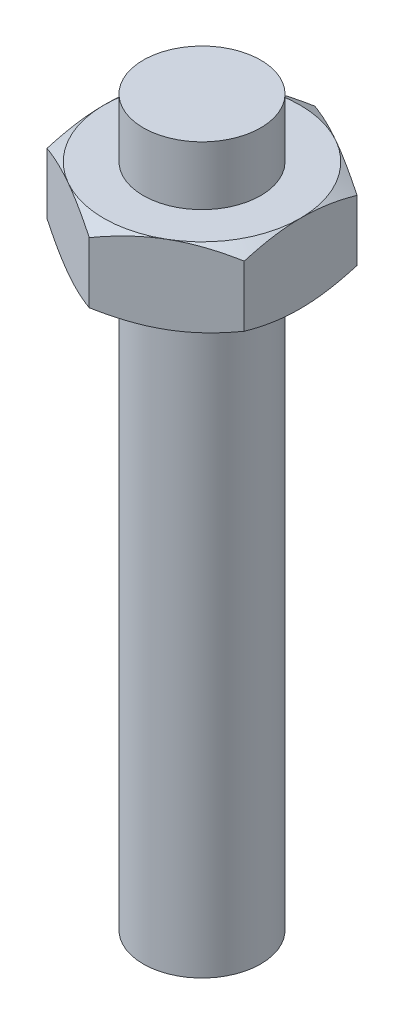
ISO-10303-21;
HEADER;
FILE_DESCRIPTION(('STEP AP214'),'2;1');
FILE_NAME('part.step','',(''),(''),'','','');
FILE_SCHEMA(('AUTOMOTIVE_DESIGN { 1 0 10303 214 1 1 1 1 }'));
ENDSEC;
DATA;
#1=APPLICATION_CONTEXT('core data for automotive mechanical design processes');
#2=APPLICATION_PROTOCOL_DEFINITION('international standard','automotive_design',2000,#1);
#3=PRODUCT_CONTEXT('',#1,'mechanical');
#4=PRODUCT('Part','Part','',(#3));
#5=PRODUCT_RELATED_PRODUCT_CATEGORY('part','',(#4));
#6=PRODUCT_DEFINITION_FORMATION('','',#4);
#7=PRODUCT_DEFINITION_CONTEXT('part definition',#1,'design');
#8=PRODUCT_DEFINITION('design','',#6,#7);
#9=PRODUCT_DEFINITION_SHAPE('','',#8);
#10=(LENGTH_UNIT() NAMED_UNIT(*) SI_UNIT(.MILLI.,.METRE.));
#11=(NAMED_UNIT(*) PLANE_ANGLE_UNIT() SI_UNIT($,.RADIAN.));
#12=(NAMED_UNIT(*) SI_UNIT($,.STERADIAN.) SOLID_ANGLE_UNIT());
#13=UNCERTAINTY_MEASURE_WITH_UNIT(LENGTH_MEASURE(1.E-05),#10,'distance_accuracy_value','');
#14=(GEOMETRIC_REPRESENTATION_CONTEXT(3) GLOBAL_UNCERTAINTY_ASSIGNED_CONTEXT((#13)) GLOBAL_UNIT_ASSIGNED_CONTEXT((#10,
#11,#12)) REPRESENTATION_CONTEXT('',''));
#15=CARTESIAN_POINT('',(0.,0.,0.));
#16=DIRECTION('',(0.,0.,1.));
#17=DIRECTION('',(1.,0.,0.));
#18=AXIS2_PLACEMENT_3D('',#15,#16,#17);
#19=CARTESIAN_POINT('',(0.,0.,0.));
#20=DIRECTION('',(0.,1.,0.));
#21=DIRECTION('',(0.,0.,1.));
#22=AXIS2_PLACEMENT_3D('',#19,#20,#21);
#23=PLANE('',#22);
#24=CARTESIAN_POINT('',(0.,0.,0.));
#25=DIRECTION('',(0.,1.,0.));
#26=DIRECTION('',(0.,0.,1.));
#27=AXIS2_PLACEMENT_3D('',#24,#25,#26);
#28=CIRCLE('',#27,5.01430599676595);
#29=CARTESIAN_POINT('',(2.5284905831747,0.,4.33012701892218));
#30=VERTEX_POINT('',#29);
#31=CARTESIAN_POINT('',(5.01424529158734,0.,-0.0246735687979292));
#32=VERTEX_POINT('',#31);
#33=EDGE_CURVE('E44',#30,#32,#28,.T.);
#34=ORIENTED_EDGE('',*,*,#33,.F.);
#35=CARTESIAN_POINT('',(-2.48575470841264,0.,4.35480058772011));
#36=VERTEX_POINT('',#35);
#37=EDGE_CURVE('E132',#36,#30,#28,.T.);
#38=ORIENTED_EDGE('',*,*,#37,.F.);
#39=CARTESIAN_POINT('',(-5.01424529158734,0.,0.02467356879793));
#40=VERTEX_POINT('',#39);
#41=EDGE_CURVE('E176',#40,#36,#28,.T.);
#42=ORIENTED_EDGE('',*,*,#41,.F.);
#43=CARTESIAN_POINT('',(-2.5284905831747,0.,-4.33012701892218));
#44=VERTEX_POINT('',#43);
#45=EDGE_CURVE('E177',#44,#40,#28,.T.);
#46=ORIENTED_EDGE('',*,*,#45,.F.);
#47=CARTESIAN_POINT('',(2.48575470841264,0.,-4.35480058772011));
#48=VERTEX_POINT('',#47);
#49=EDGE_CURVE('E180',#48,#44,#28,.T.);
#50=ORIENTED_EDGE('',*,*,#49,.F.);
#51=CARTESIAN_POINT('',(0.,0.,0.));
#52=DIRECTION('',(0.,-1.,0.));
#53=DIRECTION('',(0.,0.,-1.));
#54=AXIS2_PLACEMENT_3D('',#51,#52,#53);
#55=CIRCLE('',#54,5.01430599676595);
#56=EDGE_CURVE('E138',#48,#32,#55,.T.);
#57=ORIENTED_EDGE('',*,*,#56,.T.);
#58=EDGE_LOOP('',(#34,#38,#42,#46,#50,#57));
#59=FACE_BOUND('',#58,.T.);
#60=CARTESIAN_POINT('',(0.,0.,0.));
#61=DIRECTION('',(0.,1.,0.));
#62=DIRECTION('',(0.,0.,1.));
#63=AXIS2_PLACEMENT_3D('',#60,#61,#62);
#64=CIRCLE('',#63,3.);
#65=CARTESIAN_POINT('',(0.,0.,3.));
#66=VERTEX_POINT('',#65);
#67=EDGE_CURVE('E12',#66,#66,#64,.F.);
#68=ORIENTED_EDGE('',*,*,#67,.F.);
#69=EDGE_LOOP('',(#68));
#70=FACE_BOUND('',#69,.T.);
#71=ADVANCED_FACE('F35',(#59,#70),#23,.F.);
#72=CARTESIAN_POINT('',(0.,4.,0.));
#73=DIRECTION('',(0.,1.,0.));
#74=DIRECTION('',(0.,0.,1.));
#75=AXIS2_PLACEMENT_3D('',#72,#73,#74);
#76=PLANE('',#75);
#77=CARTESIAN_POINT('',(0.,4.,0.));
#78=DIRECTION('',(0.,1.,0.));
#79=DIRECTION('',(0.,0.,1.));
#80=AXIS2_PLACEMENT_3D('',#77,#78,#79);
#81=CIRCLE('',#80,5.01430599676595);
#82=CARTESIAN_POINT('',(-2.48575470841264,4.,4.35480058772011));
#83=VERTEX_POINT('',#82);
#84=CARTESIAN_POINT('',(2.5284905831747,4.,4.33012701892218));
#85=VERTEX_POINT('',#84);
#86=EDGE_CURVE('E173',#83,#85,#81,.T.);
#87=ORIENTED_EDGE('',*,*,#86,.T.);
#88=CARTESIAN_POINT('',(0.,4.,0.));
#89=DIRECTION('',(0.,1.,0.));
#90=DIRECTION('',(0.,0.,1.));
#91=AXIS2_PLACEMENT_3D('',#88,#89,#90);
#92=CIRCLE('',#91,5.01430599676595);
#93=CARTESIAN_POINT('',(5.01424529158734,4.,-0.0246735687979292));
#94=VERTEX_POINT('',#93);
#95=EDGE_CURVE('E297',#85,#94,#92,.T.);
#96=ORIENTED_EDGE('',*,*,#95,.T.);
#97=CARTESIAN_POINT('',(2.48575470841264,4.,-4.35480058772011));
#98=VERTEX_POINT('',#97);
#99=EDGE_CURVE('E175',#94,#98,#81,.T.);
#100=ORIENTED_EDGE('',*,*,#99,.T.);
#101=CARTESIAN_POINT('',(-2.5284905831747,4.,-4.33012701892218));
#102=VERTEX_POINT('',#101);
#103=EDGE_CURVE('E179',#98,#102,#81,.T.);
#104=ORIENTED_EDGE('',*,*,#103,.T.);
#105=CARTESIAN_POINT('',(-5.01424529158734,4.,0.02467356879793));
#106=VERTEX_POINT('',#105);
#107=EDGE_CURVE('E293',#102,#106,#81,.T.);
#108=ORIENTED_EDGE('',*,*,#107,.T.);
#109=EDGE_CURVE('E174',#106,#83,#81,.T.);
#110=ORIENTED_EDGE('',*,*,#109,.T.);
#111=EDGE_LOOP('',(#87,#96,#100,#104,#108,#110));
#112=FACE_BOUND('',#111,.T.);
#113=CARTESIAN_POINT('',(0.,4.,0.));
#114=DIRECTION('',(0.,1.,0.));
#115=DIRECTION('',(0.,0.,1.));
#116=AXIS2_PLACEMENT_3D('',#113,#114,#115);
#117=CIRCLE('',#116,3.);
#118=CARTESIAN_POINT('',(0.,4.,3.));
#119=VERTEX_POINT('',#118);
#120=EDGE_CURVE('E369',#119,#119,#117,.T.);
#121=ORIENTED_EDGE('',*,*,#120,.F.);
#122=EDGE_LOOP('',(#121));
#123=FACE_BOUND('',#122,.T.);
#124=ADVANCED_FACE('F294',(#112,#123),#76,.T.);
#125=CARTESIAN_POINT('',(5.02849058317469,4.,2.87030230008283));
#126=DIRECTION('',(-0.999987893603092,0.,0.00492063484235761));
#127=DIRECTION('',(0.00492063484235761,0.,0.999987893603092));
#128=AXIS2_PLACEMENT_3D('',#125,#126,#127);
#129=PLANE('',#128);
#130=CARTESIAN_POINT('',(4.9999990158611,0.447917484700277,-2.91984943767869));
#131=CARTESIAN_POINT('',(5.00125108658539,0.374446528137613,-2.66539943146302));
#132=CARTESIAN_POINT('',(5.00251386630712,0.307621421446591,-2.40877310691777));
#133=CARTESIAN_POINT('',(5.00506129162112,0.190977949349087,-1.89107680238245));
#134=CARTESIAN_POINT('',(5.00634598247228,0.14120084471822,-1.62999762472705));
#135=CARTESIAN_POINT('',(5.00889963872586,0.0637294768664885,-1.11103504778139));
#136=CARTESIAN_POINT('',(5.01016820644773,0.0355191827968383,-0.853232466462973));
#137=CARTESIAN_POINT('',(5.01207552012836,0.0102227694877358,-0.465621792020172));
#138=CARTESIAN_POINT('',(5.01271172642389,0.00462573641110162,-0.336329817762157));
#139=CARTESIAN_POINT('',(5.01398472688311,-0.000800215533808021,-0.0776264007129085));
#140=CARTESIAN_POINT('',(5.01462152102803,-0.000629312581884306,0.0517850382643947));
#141=CARTESIAN_POINT('',(5.01636613881153,0.00777692395854868,0.406332107566666));
#142=CARTESIAN_POINT('',(5.01747338430081,0.0218934907406079,0.631350244454539));
#143=CARTESIAN_POINT('',(5.01968052664195,0.0666562759325538,1.07989310351669));
#144=CARTESIAN_POINT('',(5.02078041573633,0.0973177942957524,1.30341624919304));
#145=CARTESIAN_POINT('',(5.02299200456623,0.173963342665548,1.75286273859509));
#146=CARTESIAN_POINT('',(5.0241034251966,0.220272131434008,1.97872936163798));
#147=CARTESIAN_POINT('',(5.02630969163108,0.325374511175889,2.42709421601792));
#148=CARTESIAN_POINT('',(5.02740456569219,0.384143412596234,2.6495981898347));
#149=CARTESIAN_POINT('',(5.02849156731357,0.447917484700276,2.87050230008283));
#150=B_SPLINE_CURVE_WITH_KNOTS('',3,(#130,#131,#132,#133,#134,#135,#136,#137,#138,#139,#140,
#141,#142,#143,#144,#145,#146,#147,#148,#149),.UNSPECIFIED.,.F.,.F.,(4,2,2,2,2,2,2,2,2,4),(0.,
0.794821338024906,1.59155298495652,2.36856665618577,2.75669843208432,3.14481821804768,
3.82050145746416,4.49681060885583,5.18811978674575,5.87807173689202),.UNSPECIFIED.);
#151=CARTESIAN_POINT('',(4.99999999999998,0.447859747478655,-2.91964943767869));
#152=VERTEX_POINT('',#151);
#153=EDGE_CURVE('E51',#152,#32,#150,.T.);
#154=ORIENTED_EDGE('',*,*,#153,.F.);
#155=DIRECTION('',(0.,-1.,0.));
#156=VECTOR('',#155,1.);
#157=CARTESIAN_POINT('',(4.99999999999998,4.,-2.91964943767869));
#158=LINE('',#157,#156);
#159=CARTESIAN_POINT('',(4.99999999999998,3.55214025252135,-2.91964943767869));
#160=VERTEX_POINT('',#159);
#161=EDGE_CURVE('E170',#160,#152,#158,.T.);
#162=ORIENTED_EDGE('',*,*,#161,.F.);
#163=CARTESIAN_POINT('',(5.02849156731357,3.55208251529972,2.87050230008283));
#164=CARTESIAN_POINT('',(5.02723949658928,3.62555347186239,2.61605229386716));
#165=CARTESIAN_POINT('',(5.02597671686755,3.69237857855341,2.35942596932191));
#166=CARTESIAN_POINT('',(5.02342929155355,3.80902205065091,1.84172966478659));
#167=CARTESIAN_POINT('',(5.02214460070239,3.85879915528178,1.58065048713119));
#168=CARTESIAN_POINT('',(5.01959094444881,3.93627052313351,1.06168791018553));
#169=CARTESIAN_POINT('',(5.01832237672694,3.96448081720316,0.803885328867112));
#170=CARTESIAN_POINT('',(5.01641506304631,3.98977723051226,0.416274654424311));
#171=CARTESIAN_POINT('',(5.01577885675078,3.9953742635889,0.286982680166297));
#172=CARTESIAN_POINT('',(5.01450585629156,4.00080021553381,0.028279263117048));
#173=CARTESIAN_POINT('',(5.01386906214664,4.00062931258188,-0.101132175860255));
#174=CARTESIAN_POINT('',(5.01212444436314,3.99222307604145,-0.455679245162526));
#175=CARTESIAN_POINT('',(5.01101719887386,3.97810650925939,-0.680697382050399));
#176=CARTESIAN_POINT('',(5.00881005653272,3.93334372406745,-1.12924024111255));
#177=CARTESIAN_POINT('',(5.00771016743834,3.90268220570425,-1.3527633867889));
#178=CARTESIAN_POINT('',(5.00549857860844,3.82603665733445,-1.80220987619095));
#179=CARTESIAN_POINT('',(5.00438715797807,3.77972786856599,-2.02807649923384));
#180=CARTESIAN_POINT('',(5.00218089154359,3.67462548882411,-2.47644135361378));
#181=CARTESIAN_POINT('',(5.00108601748248,3.61585658740377,-2.69894532743056));
#182=CARTESIAN_POINT('',(4.9999990158611,3.55208251529972,-2.91984943767869));
#183=B_SPLINE_CURVE_WITH_KNOTS('',3,(#163,#164,#165,#166,#167,#168,#169,#170,#171,#172,#173,
#174,#175,#176,#177,#178,#179,#180,#181,#182),.UNSPECIFIED.,.F.,.F.,(4,2,2,2,2,2,2,2,2,4),(0.,
0.794821338024905,1.59155298495652,2.36856665618577,2.75669843208432,3.14481821804768,
3.82050145746416,4.49681060885583,5.18811978674575,5.87807173689202),.UNSPECIFIED.);
#184=EDGE_CURVE('E272',#94,#160,#183,.T.);
#185=ORIENTED_EDGE('',*,*,#184,.F.);
#186=CARTESIAN_POINT('',(5.02849058317469,3.55214025252135,2.87030230008283));
#187=VERTEX_POINT('',#186);
#188=EDGE_CURVE('E161',#187,#94,#183,.T.);
#189=ORIENTED_EDGE('',*,*,#188,.F.);
#190=DIRECTION('',(0.,-1.,0.));
#191=VECTOR('',#190,1.);
#192=CARTESIAN_POINT('',(5.02849058317469,4.,2.87030230008283));
#193=LINE('',#192,#191);
#194=CARTESIAN_POINT('',(5.02849058317469,0.447859747478654,2.87030230008283));
#195=VERTEX_POINT('',#194);
#196=EDGE_CURVE('E156',#187,#195,#193,.T.);
#197=ORIENTED_EDGE('',*,*,#196,.T.);
#198=EDGE_CURVE('E148',#32,#195,#150,.T.);
#199=ORIENTED_EDGE('',*,*,#198,.F.);
#200=EDGE_LOOP('',(#154,#162,#185,#189,#197,#199));
#201=FACE_BOUND('',#200,.T.);
#202=ADVANCED_FACE('F37',(#201),#129,.F.);
#203=CARTESIAN_POINT('',(4.99999999999998,4.,-2.91964943767869));
#204=DIRECTION('',(-0.495732552025317,0.,0.868475236758347));
#205=DIRECTION('',(0.868475236758347,0.,0.495732552025317));
#206=AXIS2_PLACEMENT_3D('',#203,#204,#205);
#207=PLANE('',#206);
#208=CARTESIAN_POINT('',(-0.0286905831747077,0.447926228072088,-5.79006589934749));
#209=CARTESIAN_POINT('',(0.192296065465768,0.374454553334258,-5.66392496791119));
#210=CARTESIAN_POINT('',(0.415172818406593,0.307628683938442,-5.53670514995199));
#211=CARTESIAN_POINT('',(0.864785619640762,0.190983628851342,-5.28006259764271));
#212=CARTESIAN_POINT('',(1.09152965626008,0.141205704931097,-5.15063530349282));
#213=CARTESIAN_POINT('',(1.54224222213373,0.0637327171769791,-4.89336499680635));
#214=CARTESIAN_POINT('',(1.76614056016625,0.0355216175545699,-4.76556204997579));
#215=CARTESIAN_POINT('',(2.1027756546474,0.0102240367495575,-4.57340806857809));
#216=CARTESIAN_POINT('',(2.21506414638369,0.00462662144995524,-4.50931290706343));
#217=CARTESIAN_POINT('',(2.43974490113167,-0.000800072082288288,-4.38106335056723));
#218=CARTESIAN_POINT('',(2.5521371608308,-0.000629528483201749,-4.31690895747652));
#219=CARTESIAN_POINT('',(2.86006040720272,0.00777586246854357,-4.1411439266604));
#220=CARTESIAN_POINT('',(3.05548936155995,0.0218922835307172,-4.02959152978981));
#221=CARTESIAN_POINT('',(3.44505022864037,0.0666554626951286,-3.80722709769868));
#222=CARTESIAN_POINT('',(3.63918077207081,0.0973175223166123,-3.69641584408132));
#223=CARTESIAN_POINT('',(4.02952650777377,0.173964760147534,-3.47360340275655));
#224=CARTESIAN_POINT('',(4.22569243550712,0.220274718850526,-3.36163033563878));
#225=CARTESIAN_POINT('',(4.61509875558895,0.325379883010159,-3.13935412019999));
#226=CARTESIAN_POINT('',(4.80834413567574,0.384150396705421,-3.02904812483839));
#227=CARTESIAN_POINT('',(5.00019999999998,0.447926228072089,-2.91953527609272));
#228=B_SPLINE_CURVE_WITH_KNOTS('',3,(#208,#209,#210,#211,#212,#213,#214,#215,#216,#217,#218,
#219,#220,#221,#222,#223,#224,#225,#226,#227),.UNSPECIFIED.,.F.,.F.,(4,2,2,2,2,2,2,2,2,4),(0.,
0.794823411774109,1.59155718924444,2.36857273607155,2.75670543860724,3.1448261520024,
3.82052279419409,4.49684539888776,5.18816874193885,5.87813475679396),.UNSPECIFIED.);
#229=CARTESIAN_POINT('',(-0.0284905831747079,0.447859747478655,-5.78995173776152));
#230=VERTEX_POINT('',#229);
#231=EDGE_CURVE('E59',#230,#48,#228,.T.);
#232=ORIENTED_EDGE('',*,*,#231,.F.);
#233=DIRECTION('',(0.,-1.,0.));
#234=VECTOR('',#233,1.);
#235=CARTESIAN_POINT('',(-0.0284905831747077,4.,-5.78995173776152));
#236=LINE('',#235,#234);
#237=CARTESIAN_POINT('',(-0.0284905831747076,3.55214025252135,-5.78995173776152));
#238=VERTEX_POINT('',#237);
#239=EDGE_CURVE('E167',#238,#230,#236,.T.);
#240=ORIENTED_EDGE('',*,*,#239,.F.);
#241=CARTESIAN_POINT('',(5.00019999999998,3.55207377192791,-2.91953527609272));
#242=CARTESIAN_POINT('',(4.7792133513595,3.62554544666574,-3.04567620752903));
#243=CARTESIAN_POINT('',(4.55633659841868,3.69237131606156,-3.17289602548823));
#244=CARTESIAN_POINT('',(4.10672379718451,3.80901637114866,-3.42953857779751));
#245=CARTESIAN_POINT('',(3.8799797605652,3.8587942950689,-3.55896587194739));
#246=CARTESIAN_POINT('',(3.42926719469154,3.93626728282302,-3.81623617863386));
#247=CARTESIAN_POINT('',(3.20536885665902,3.96447838244543,-3.94403912546443));
#248=CARTESIAN_POINT('',(2.86873376217788,3.98977596325044,-4.13619310686212));
#249=CARTESIAN_POINT('',(2.75644527044158,3.99537337855004,-4.20028826837678));
#250=CARTESIAN_POINT('',(2.5317645156936,4.00080007208229,-4.32853782487298));
#251=CARTESIAN_POINT('',(2.41937225599447,4.0006295284832,-4.39269221796369));
#252=CARTESIAN_POINT('',(2.11144900962255,3.99222413753146,-4.56845724877982));
#253=CARTESIAN_POINT('',(1.91602005526533,3.97810771646928,-4.68000964565041));
#254=CARTESIAN_POINT('',(1.5264591881849,3.93334453730487,-4.90237407774153));
#255=CARTESIAN_POINT('',(1.33232864475447,3.90268247768339,-5.0131853313589));
#256=CARTESIAN_POINT('',(0.941982909051504,3.82603523985247,-5.23599777268366));
#257=CARTESIAN_POINT('',(0.745816981318151,3.77972528114947,-5.34797083980144));
#258=CARTESIAN_POINT('',(0.356410661236327,3.67462011698984,-5.57024705524022));
#259=CARTESIAN_POINT('',(0.163165281149531,3.61584960329458,-5.68055305060182));
#260=CARTESIAN_POINT('',(-0.0286905831747084,3.55207377192791,-5.79006589934749));
#261=B_SPLINE_CURVE_WITH_KNOTS('',3,(#241,#242,#243,#244,#245,#246,#247,#248,#249,#250,#251,
#252,#253,#254,#255,#256,#257,#258,#259,#260),.UNSPECIFIED.,.F.,.F.,(4,2,2,2,2,2,2,2,2,4),(0.,
0.794823411774109,1.59155718924444,2.36857273607156,2.75670543860725,3.1448261520024,
3.82052279419409,4.49684539888776,5.18816874193885,5.87813475679396),.UNSPECIFIED.);
#262=EDGE_CURVE('E260',#98,#238,#261,.T.);
#263=ORIENTED_EDGE('',*,*,#262,.F.);
#264=EDGE_CURVE('E265',#160,#98,#261,.T.);
#265=ORIENTED_EDGE('',*,*,#264,.F.);
#266=ORIENTED_EDGE('',*,*,#161,.T.);
#267=EDGE_CURVE('E207',#48,#152,#228,.T.);
#268=ORIENTED_EDGE('',*,*,#267,.F.);
#269=EDGE_LOOP('',(#232,#240,#263,#265,#266,#268));
#270=FACE_BOUND('',#269,.T.);
#271=ADVANCED_FACE('F252',(#270),#207,.F.);
#272=CARTESIAN_POINT('',(-0.0284905831747077,4.,-5.78995173776152));
#273=DIRECTION('',(0.504255341577775,0.,0.863554601915989));
#274=DIRECTION('',(0.863554601915989,0.,-0.504255341577775));
#275=AXIS2_PLACEMENT_3D('',#272,#273,#274);
#276=PLANE('',#275);
#277=CARTESIAN_POINT('',(-5.02869058317469,0.447926606897626,-2.87018551410532));
#278=CARTESIAN_POINT('',(-4.8089559886495,0.374454901043448,-2.99849511117412));
#279=CARTESIAN_POINT('',(-4.58734199871511,0.307628998601953,-3.12790214339286));
#280=CARTESIAN_POINT('',(-4.14027658772118,0.190983874928712,-3.38895699855567));
#281=CARTESIAN_POINT('',(-3.91481722358392,0.141205915511134,-3.52060945970022));
#282=CARTESIAN_POINT('',(-3.46665827795118,0.0637328575715192,-3.78230286242168));
#283=CARTESIAN_POINT('',(-3.2440284900705,0.0355217230469225,-3.91230304942095));
#284=CARTESIAN_POINT('',(-2.90930068132805,0.010224091657783,-4.10776062113501));
#285=CARTESIAN_POINT('',(-2.79764838636964,0.00462665979759133,-4.17295773317319));
#286=CARTESIAN_POINT('',(-2.5742406125009,-0.000800065865445418,-4.30341220944297));
#287=CARTESIAN_POINT('',(-2.46248513688438,-0.000629537836063153,-4.36866957175122));
#288=CARTESIAN_POINT('',(-2.15630635232406,0.00777581647830405,-4.54745651498536));
#289=CARTESIAN_POINT('',(-1.96198449720749,0.0218922312264838,-4.66092685398932));
#290=CARTESIAN_POINT('',(-1.574630481177,0.0666554274600818,-4.88711444100652));
#291=CARTESIAN_POINT('',(-1.38159968180313,0.0973175105325956,-4.99983089397584));
#292=CARTESIAN_POINT('',(-0.993465240699849,0.173964821562911,-5.22647419451803));
#293=CARTESIAN_POINT('',(-0.798410584532968,0.220274830955858,-5.34037243795688));
#294=CARTESIAN_POINT('',(-0.411210237815937,0.325380115756476,-5.56647029286915));
#295=CARTESIAN_POINT('',(-0.21905958776662,0.384150699307086,-5.67867280034237));
#296=CARTESIAN_POINT('',(-0.0282905831747069,0.447926606897628,-5.79006852373903));
#297=B_SPLINE_CURVE_WITH_KNOTS('',3,(#277,#278,#279,#280,#281,#282,#283,#284,#285,#286,#287,
#288,#289,#290,#291,#292,#293,#294,#295,#296),.UNSPECIFIED.,.F.,.F.,(4,2,2,2,2,2,2,2,2,4),(0.,
0.794823501623766,1.59155737140428,2.36857299949575,2.75670574218,3.14482649575815,
3.82052371865139,4.49684690623585,5.18817086302087,5.8781374872575),.UNSPECIFIED.);
#298=CARTESIAN_POINT('',(-5.02849058317469,0.447859747478653,-2.87030230008283));
#299=VERTEX_POINT('',#298);
#300=EDGE_CURVE('E192',#299,#44,#297,.T.);
#301=ORIENTED_EDGE('',*,*,#300,.F.);
#302=DIRECTION('',(0.,-1.,0.));
#303=VECTOR('',#302,1.);
#304=CARTESIAN_POINT('',(-5.02849058317469,4.,-2.87030230008283));
#305=LINE('',#304,#303);
#306=CARTESIAN_POINT('',(-5.02849058317469,3.55214025252135,-2.87030230008283));
#307=VERTEX_POINT('',#306);
#308=EDGE_CURVE('E158',#307,#299,#305,.T.);
#309=ORIENTED_EDGE('',*,*,#308,.F.);
#310=CARTESIAN_POINT('',(-0.0282905831747075,3.55207339310237,-5.79006852373903));
#311=CARTESIAN_POINT('',(-0.248025177699891,3.62554509895655,-5.66175892667023));
#312=CARTESIAN_POINT('',(-0.469639167634286,3.69237100139805,-5.53235189445149));
#313=CARTESIAN_POINT('',(-0.916704578628218,3.80901612507129,-5.27129703928868));
#314=CARTESIAN_POINT('',(-1.14216394276548,3.85879408448887,-5.13964457814413));
#315=CARTESIAN_POINT('',(-1.59032288839821,3.93626714242848,-4.87795117542267));
#316=CARTESIAN_POINT('',(-1.81295267627889,3.96447827695308,-4.7479509884234));
#317=CARTESIAN_POINT('',(-2.14768048502134,3.98977590834222,-4.55249341670934));
#318=CARTESIAN_POINT('',(-2.25933277997976,3.99537334020241,-4.48729630467116));
#319=CARTESIAN_POINT('',(-2.4827405538485,4.00080006586545,-4.35684182840138));
#320=CARTESIAN_POINT('',(-2.59449602946501,4.00062953783606,-4.29158446609313));
#321=CARTESIAN_POINT('',(-2.90067481402534,3.9922241835217,-4.11279752285899));
#322=CARTESIAN_POINT('',(-3.09499666914191,3.97810776877352,-3.99932718385503));
#323=CARTESIAN_POINT('',(-3.4823506851724,3.93334457253992,-3.77313959683783));
#324=CARTESIAN_POINT('',(-3.67538148454626,3.90268248946741,-3.66042314386851));
#325=CARTESIAN_POINT('',(-4.06351592564955,3.82603517843709,-3.43377984332632));
#326=CARTESIAN_POINT('',(-4.25857058181643,3.77972516904414,-3.31988159988747));
#327=CARTESIAN_POINT('',(-4.64577092853346,3.67461988424353,-3.0937837449752));
#328=CARTESIAN_POINT('',(-4.83792157858278,3.61584930069292,-2.98158123750198));
#329=CARTESIAN_POINT('',(-5.02869058317469,3.55207339310237,-2.87018551410532));
#330=B_SPLINE_CURVE_WITH_KNOTS('',3,(#310,#311,#312,#313,#314,#315,#316,#317,#318,#319,#320,
#321,#322,#323,#324,#325,#326,#327,#328,#329),.UNSPECIFIED.,.F.,.F.,(4,2,2,2,2,2,2,2,2,4),(0.,
0.794823501623766,1.59155737140428,2.36857299949575,2.75670574218,3.14482649575815,
3.82052371865139,4.49684690623585,5.18817086302087,5.8781374872575),.UNSPECIFIED.);
#331=EDGE_CURVE('E267',#102,#307,#330,.T.);
#332=ORIENTED_EDGE('',*,*,#331,.F.);
#333=EDGE_CURVE('E266',#238,#102,#330,.T.);
#334=ORIENTED_EDGE('',*,*,#333,.F.);
#335=ORIENTED_EDGE('',*,*,#239,.T.);
#336=EDGE_CURVE('E204',#44,#230,#297,.T.);
#337=ORIENTED_EDGE('',*,*,#336,.F.);
#338=EDGE_LOOP('',(#301,#309,#332,#334,#335,#337));
#339=FACE_BOUND('',#338,.T.);
#340=ADVANCED_FACE('F255',(#339),#276,.F.);
#341=CARTESIAN_POINT('',(-5.02849058317469,4.,-2.87030230008283));
#342=DIRECTION('',(0.999987893603092,0.,-0.00492063484235776));
#343=DIRECTION('',(-0.00492063484235776,0.,-0.999987893603092));
#344=AXIS2_PLACEMENT_3D('',#341,#342,#343);
#345=PLANE('',#344);
#346=CARTESIAN_POINT('',(-4.9999990158611,0.447917484700276,2.91984943767869));
#347=CARTESIAN_POINT('',(-5.00125108658539,0.374446528137612,2.66539943146302));
#348=CARTESIAN_POINT('',(-5.00251386630712,0.30762142144659,2.40877310691777));
#349=CARTESIAN_POINT('',(-5.00506129162112,0.190977949349086,1.89107680238245));
#350=CARTESIAN_POINT('',(-5.00634598247228,0.14120084471822,1.62999762472705));
#351=CARTESIAN_POINT('',(-5.00889963872586,0.0637294768664876,1.11103504778139));
#352=CARTESIAN_POINT('',(-5.01016820644773,0.0355191827968375,0.853232466462975));
#353=CARTESIAN_POINT('',(-5.01207552012836,0.010222769487735,0.465621792020174));
#354=CARTESIAN_POINT('',(-5.01271172642389,0.00462573641110095,0.336329817762159));
#355=CARTESIAN_POINT('',(-5.01398472688311,-0.000800215533808893,0.0776264007129104));
#356=CARTESIAN_POINT('',(-5.01462152102803,-0.000629312581885465,-0.0517850382643928));
#357=CARTESIAN_POINT('',(-5.01636613881153,0.00777692395854731,-0.406332107566664));
#358=CARTESIAN_POINT('',(-5.01747338430081,0.0218934907406071,-0.631350244454537));
#359=CARTESIAN_POINT('',(-5.01968052664194,0.0666562759325533,-1.07989310351668));
#360=CARTESIAN_POINT('',(-5.02078041573633,0.0973177942957519,-1.30341624919304));
#361=CARTESIAN_POINT('',(-5.02299200456623,0.173963342665548,-1.75286273859509));
#362=CARTESIAN_POINT('',(-5.0241034251966,0.220272131434007,-1.97872936163798));
#363=CARTESIAN_POINT('',(-5.02630969163108,0.325374511175888,-2.42709421601792));
#364=CARTESIAN_POINT('',(-5.02740456569219,0.384143412596232,-2.64959818983469));
#365=CARTESIAN_POINT('',(-5.02849156731357,0.447917484700275,-2.87050230008283));
#366=B_SPLINE_CURVE_WITH_KNOTS('',3,(#346,#347,#348,#349,#350,#351,#352,#353,#354,#355,#356,
#357,#358,#359,#360,#361,#362,#363,#364,#365),.UNSPECIFIED.,.F.,.F.,(4,2,2,2,2,2,2,2,2,4),(0.,
0.794821338024906,1.59155298495652,2.36856665618577,2.75669843208432,3.14481821804768,
3.82050145746416,4.49681060885583,5.18811978674575,5.87807173689202),.UNSPECIFIED.);
#367=CARTESIAN_POINT('',(-4.99999999999998,0.447859747478655,2.91964943767869));
#368=VERTEX_POINT('',#367);
#369=EDGE_CURVE('E201',#368,#40,#366,.T.);
#370=ORIENTED_EDGE('',*,*,#369,.F.);
#371=DIRECTION('',(0.,-1.,0.));
#372=VECTOR('',#371,1.);
#373=CARTESIAN_POINT('',(-4.99999999999998,4.,2.91964943767869));
#374=LINE('',#373,#372);
#375=CARTESIAN_POINT('',(-4.99999999999998,3.55214025252135,2.91964943767869));
#376=VERTEX_POINT('',#375);
#377=EDGE_CURVE('E155',#376,#368,#374,.T.);
#378=ORIENTED_EDGE('',*,*,#377,.F.);
#379=CARTESIAN_POINT('',(-5.02849156731357,3.55208251529973,-2.87050230008283));
#380=CARTESIAN_POINT('',(-5.02723949658928,3.62555347186239,-2.61605229386716));
#381=CARTESIAN_POINT('',(-5.02597671686755,3.69237857855341,-2.3594259693219));
#382=CARTESIAN_POINT('',(-5.02342929155355,3.80902205065091,-1.84172966478659));
#383=CARTESIAN_POINT('',(-5.02214460070239,3.85879915528178,-1.58065048713119));
#384=CARTESIAN_POINT('',(-5.01959094444881,3.93627052313351,-1.06168791018552));
#385=CARTESIAN_POINT('',(-5.01832237672694,3.96448081720316,-0.80388532886711));
#386=CARTESIAN_POINT('',(-5.01641506304631,3.98977723051227,-0.41627465442431));
#387=CARTESIAN_POINT('',(-5.01577885675077,3.9953742635889,-0.286982680166295));
#388=CARTESIAN_POINT('',(-5.01450585629156,4.00080021553381,-0.0282792631170463));
#389=CARTESIAN_POINT('',(-5.01386906214664,4.00062931258188,0.101132175860257));
#390=CARTESIAN_POINT('',(-5.01212444436314,3.99222307604145,0.455679245162528));
#391=CARTESIAN_POINT('',(-5.01101719887385,3.97810650925939,0.680697382050401));
#392=CARTESIAN_POINT('',(-5.00881005653272,3.93334372406745,1.12924024111255));
#393=CARTESIAN_POINT('',(-5.00771016743834,3.90268220570425,1.3527633867889));
#394=CARTESIAN_POINT('',(-5.00549857860844,3.82603665733445,1.80220987619095));
#395=CARTESIAN_POINT('',(-5.00438715797807,3.77972786856599,2.02807649923384));
#396=CARTESIAN_POINT('',(-5.00218089154358,3.67462548882411,2.47644135361379));
#397=CARTESIAN_POINT('',(-5.00108601748248,3.61585658740377,2.69894532743056));
#398=CARTESIAN_POINT('',(-4.9999990158611,3.55208251529972,2.91984943767869));
#399=B_SPLINE_CURVE_WITH_KNOTS('',3,(#379,#380,#381,#382,#383,#384,#385,#386,#387,#388,#389,
#390,#391,#392,#393,#394,#395,#396,#397,#398),.UNSPECIFIED.,.F.,.F.,(4,2,2,2,2,2,2,2,2,4),(0.,
0.794821338024905,1.59155298495652,2.36856665618577,2.75669843208432,3.14481821804768,
3.82050145746416,4.49681060885583,5.18811978674575,5.87807173689202),.UNSPECIFIED.);
#400=EDGE_CURVE('E303',#106,#376,#399,.T.);
#401=ORIENTED_EDGE('',*,*,#400,.F.);
#402=EDGE_CURVE('E301',#307,#106,#399,.T.);
#403=ORIENTED_EDGE('',*,*,#402,.F.);
#404=ORIENTED_EDGE('',*,*,#308,.T.);
#405=EDGE_CURVE('E190',#40,#299,#366,.T.);
#406=ORIENTED_EDGE('',*,*,#405,.F.);
#407=EDGE_LOOP('',(#370,#378,#401,#403,#404,#406));
#408=FACE_BOUND('',#407,.T.);
#409=ADVANCED_FACE('F199',(#408),#345,.F.);
#410=CARTESIAN_POINT('',(-4.99999999999998,4.,2.91964943767869));
#411=DIRECTION('',(0.495732552025317,0.,-0.868475236758347));
#412=DIRECTION('',(-0.868475236758347,0.,-0.495732552025317));
#413=AXIS2_PLACEMENT_3D('',#410,#411,#412);
#414=PLANE('',#413);
#415=CARTESIAN_POINT('',(0.0286905831747081,0.447926228072088,5.79006589934749));
#416=CARTESIAN_POINT('',(-0.192296065465768,0.374454553334259,5.66392496791119));
#417=CARTESIAN_POINT('',(-0.415172818406594,0.307628683938443,5.53670514995199));
#418=CARTESIAN_POINT('',(-0.864785619640762,0.190983628851342,5.28006259764271));
#419=CARTESIAN_POINT('',(-1.09152965626008,0.141205704931096,5.15063530349282));
#420=CARTESIAN_POINT('',(-1.54224222213373,0.063732717176979,4.89336499680635));
#421=CARTESIAN_POINT('',(-1.76614056016625,0.0355216175545702,4.76556204997579));
#422=CARTESIAN_POINT('',(-2.1027756546474,0.0102240367495579,4.57340806857809));
#423=CARTESIAN_POINT('',(-2.21506414638369,0.00462662144995558,4.50931290706343));
#424=CARTESIAN_POINT('',(-2.43974490113167,-0.000800072082288124,4.38106335056723));
#425=CARTESIAN_POINT('',(-2.5521371608308,-0.000629528483201724,4.31690895747652));
#426=CARTESIAN_POINT('',(-2.86006040720272,0.00777586246854352,4.1411439266604));
#427=CARTESIAN_POINT('',(-3.05548936155995,0.0218922835307175,4.02959152978981));
#428=CARTESIAN_POINT('',(-3.44505022864037,0.066655462695129,3.80722709769868));
#429=CARTESIAN_POINT('',(-3.6391807720708,0.0973175223166124,3.69641584408132));
#430=CARTESIAN_POINT('',(-4.02952650777377,0.173964760147534,3.47360340275656));
#431=CARTESIAN_POINT('',(-4.22569243550712,0.220274718850525,3.36163033563878));
#432=CARTESIAN_POINT('',(-4.61509875558894,0.325379883010158,3.13935412019999));
#433=CARTESIAN_POINT('',(-4.80834413567574,0.38415039670542,3.02904812483839));
#434=CARTESIAN_POINT('',(-5.00019999999998,0.447926228072088,2.91953527609272));
#435=B_SPLINE_CURVE_WITH_KNOTS('',3,(#415,#416,#417,#418,#419,#420,#421,#422,#423,#424,#425,
#426,#427,#428,#429,#430,#431,#432,#433,#434),.UNSPECIFIED.,.F.,.F.,(4,2,2,2,2,2,2,2,2,4),(0.,
0.794823411774109,1.59155718924444,2.36857273607155,2.75670543860724,3.1448261520024,
3.82052279419409,4.49684539888776,5.18816874193885,5.87813475679396),.UNSPECIFIED.);
#436=CARTESIAN_POINT('',(0.0284905831747081,0.447859747478655,5.78995173776152));
#437=VERTEX_POINT('',#436);
#438=EDGE_CURVE('E130',#437,#36,#435,.T.);
#439=ORIENTED_EDGE('',*,*,#438,.F.);
#440=DIRECTION('',(0.,-1.,0.));
#441=VECTOR('',#440,1.);
#442=CARTESIAN_POINT('',(0.0284905831747081,4.,5.78995173776152));
#443=LINE('',#442,#441);
#444=CARTESIAN_POINT('',(0.0284905831747081,3.55214025252134,5.78995173776152));
#445=VERTEX_POINT('',#444);
#446=EDGE_CURVE('E145',#445,#437,#443,.T.);
#447=ORIENTED_EDGE('',*,*,#446,.F.);
#448=CARTESIAN_POINT('',(-5.00019999999998,3.55207377192791,2.91953527609272));
#449=CARTESIAN_POINT('',(-4.7792133513595,3.62554544666574,3.04567620752903));
#450=CARTESIAN_POINT('',(-4.55633659841868,3.69237131606156,3.17289602548823));
#451=CARTESIAN_POINT('',(-4.10672379718451,3.80901637114866,3.42953857779751));
#452=CARTESIAN_POINT('',(-3.8799797605652,3.8587942950689,3.55896587194739));
#453=CARTESIAN_POINT('',(-3.42926719469154,3.93626728282302,3.81623617863387));
#454=CARTESIAN_POINT('',(-3.20536885665902,3.96447838244543,3.94403912546443));
#455=CARTESIAN_POINT('',(-2.86873376217787,3.98977596325044,4.13619310686212));
#456=CARTESIAN_POINT('',(-2.75644527044158,3.99537337855004,4.20028826837678));
#457=CARTESIAN_POINT('',(-2.5317645156936,4.00080007208229,4.32853782487298));
#458=CARTESIAN_POINT('',(-2.41937225599447,4.0006295284832,4.39269221796369));
#459=CARTESIAN_POINT('',(-2.11144900962255,3.99222413753146,4.56845724877982));
#460=CARTESIAN_POINT('',(-1.91602005526533,3.97810771646928,4.68000964565041));
#461=CARTESIAN_POINT('',(-1.5264591881849,3.93334453730487,4.90237407774153));
#462=CARTESIAN_POINT('',(-1.33232864475447,3.90268247768339,5.01318533135889));
#463=CARTESIAN_POINT('',(-0.941982909051503,3.82603523985247,5.23599777268366));
#464=CARTESIAN_POINT('',(-0.745816981318151,3.77972528114947,5.34797083980144));
#465=CARTESIAN_POINT('',(-0.356410661236327,3.67462011698984,5.57024705524022));
#466=CARTESIAN_POINT('',(-0.163165281149531,3.61584960329458,5.68055305060182));
#467=CARTESIAN_POINT('',(0.0286905831747086,3.55207377192791,5.79006589934749));
#468=B_SPLINE_CURVE_WITH_KNOTS('',3,(#448,#449,#450,#451,#452,#453,#454,#455,#456,#457,#458,
#459,#460,#461,#462,#463,#464,#465,#466,#467),.UNSPECIFIED.,.F.,.F.,(4,2,2,2,2,2,2,2,2,4),(0.,
0.794823411774109,1.59155718924444,2.36857273607155,2.75670543860724,3.1448261520024,
3.82052279419408,4.49684539888776,5.18816874193885,5.87813475679396),.UNSPECIFIED.);
#469=EDGE_CURVE('E310',#83,#445,#468,.T.);
#470=ORIENTED_EDGE('',*,*,#469,.F.);
#471=EDGE_CURVE('E305',#376,#83,#468,.T.);
#472=ORIENTED_EDGE('',*,*,#471,.F.);
#473=ORIENTED_EDGE('',*,*,#377,.T.);
#474=EDGE_CURVE('E147',#36,#368,#435,.T.);
#475=ORIENTED_EDGE('',*,*,#474,.F.);
#476=EDGE_LOOP('',(#439,#447,#470,#472,#473,#475));
#477=FACE_BOUND('',#476,.T.);
#478=ADVANCED_FACE('F143',(#477),#414,.F.);
#479=CARTESIAN_POINT('',(0.0284905831747081,4.,5.78995173776152));
#480=DIRECTION('',(-0.504255341577775,0.,-0.863554601915989));
#481=DIRECTION('',(-0.863554601915989,0.,0.504255341577775));
#482=AXIS2_PLACEMENT_3D('',#479,#480,#481);
#483=PLANE('',#482);
#484=CARTESIAN_POINT('',(5.02869058317469,0.447926606897627,2.87018551410532));
#485=CARTESIAN_POINT('',(4.8089559886495,0.374454901043449,2.99849511117413));
#486=CARTESIAN_POINT('',(4.58734199871511,0.307628998601954,3.12790214339286));
#487=CARTESIAN_POINT('',(4.14027658772118,0.190983874928713,3.38895699855567));
#488=CARTESIAN_POINT('',(3.91481722358392,0.141205915511135,3.52060945970022));
#489=CARTESIAN_POINT('',(3.46665827795118,0.0637328575715202,3.78230286242168));
#490=CARTESIAN_POINT('',(3.2440284900705,0.0355217230469236,3.91230304942095));
#491=CARTESIAN_POINT('',(2.90930068132805,0.0102240916577841,4.10776062113501));
#492=CARTESIAN_POINT('',(2.79764838636963,0.00462665979759228,4.17295773317319));
#493=CARTESIAN_POINT('',(2.5742406125009,-0.000800065865444331,4.30341220944297));
#494=CARTESIAN_POINT('',(2.46248513688438,-0.000629537836061869,4.36866957175123));
#495=CARTESIAN_POINT('',(2.15630635232406,0.0077758164783056,4.54745651498537));
#496=CARTESIAN_POINT('',(1.96198449720748,0.0218922312264852,4.66092685398932));
#497=CARTESIAN_POINT('',(1.57463048117699,0.066655427460083,4.88711444100653));
#498=CARTESIAN_POINT('',(1.38159968180313,0.0973175105325968,4.99983089397584));
#499=CARTESIAN_POINT('',(0.993465240699848,0.173964821562912,5.22647419451803));
#500=CARTESIAN_POINT('',(0.798410584532968,0.220274830955859,5.34037243795688));
#501=CARTESIAN_POINT('',(0.411210237815937,0.325380115756476,5.56647029286915));
#502=CARTESIAN_POINT('',(0.21905958776662,0.384150699307086,5.67867280034237));
#503=CARTESIAN_POINT('',(0.0282905831747073,0.447926606897628,5.79006852373903));
#504=B_SPLINE_CURVE_WITH_KNOTS('',3,(#484,#485,#486,#487,#488,#489,#490,#491,#492,#493,#494,
#495,#496,#497,#498,#499,#500,#501,#502,#503),.UNSPECIFIED.,.F.,.F.,(4,2,2,2,2,2,2,2,2,4),(0.,
0.794823501623766,1.59155737140428,2.36857299949575,2.75670574218,3.14482649575815,
3.82052371865139,4.49684690623585,5.18817086302087,5.8781374872575),.UNSPECIFIED.);
#505=EDGE_CURVE('E137',#195,#30,#504,.T.);
#506=ORIENTED_EDGE('',*,*,#505,.F.);
#507=ORIENTED_EDGE('',*,*,#196,.F.);
#508=CARTESIAN_POINT('',(0.0282905831747079,3.55207339310237,5.79006852373903));
#509=CARTESIAN_POINT('',(0.248025177699892,3.62554509895655,5.66175892667023));
#510=CARTESIAN_POINT('',(0.469639167634287,3.69237100139805,5.53235189445149));
#511=CARTESIAN_POINT('',(0.916704578628219,3.80901612507129,5.27129703928868));
#512=CARTESIAN_POINT('',(1.14216394276548,3.85879408448886,5.13964457814413));
#513=CARTESIAN_POINT('',(1.59032288839821,3.93626714242848,4.87795117542268));
#514=CARTESIAN_POINT('',(1.81295267627889,3.96447827695308,4.7479509884234));
#515=CARTESIAN_POINT('',(2.14768048502134,3.98977590834222,4.55249341670934));
#516=CARTESIAN_POINT('',(2.25933277997976,3.99537334020241,4.48729630467116));
#517=CARTESIAN_POINT('',(2.4827405538485,4.00080006586544,4.35684182840138));
#518=CARTESIAN_POINT('',(2.59449602946501,4.00062953783606,4.29158446609313));
#519=CARTESIAN_POINT('',(2.90067481402534,3.9922241835217,4.11279752285899));
#520=CARTESIAN_POINT('',(3.09499666914191,3.97810776877352,3.99932718385503));
#521=CARTESIAN_POINT('',(3.4823506851724,3.93334457253992,3.77313959683783));
#522=CARTESIAN_POINT('',(3.67538148454627,3.9026824894674,3.66042314386851));
#523=CARTESIAN_POINT('',(4.06351592564955,3.82603517843709,3.43377984332633));
#524=CARTESIAN_POINT('',(4.25857058181643,3.77972516904414,3.31988159988748));
#525=CARTESIAN_POINT('',(4.64577092853346,3.67461988424352,3.0937837449752));
#526=CARTESIAN_POINT('',(4.83792157858278,3.61584930069291,2.98158123750198));
#527=CARTESIAN_POINT('',(5.02869058317469,3.55207339310237,2.87018551410532));
#528=B_SPLINE_CURVE_WITH_KNOTS('',3,(#508,#509,#510,#511,#512,#513,#514,#515,#516,#517,#518,
#519,#520,#521,#522,#523,#524,#525,#526,#527),.UNSPECIFIED.,.F.,.F.,(4,2,2,2,2,2,2,2,2,4),(0.,
0.794823501623766,1.59155737140428,2.36857299949575,2.75670574218,3.14482649575815,
3.82052371865139,4.49684690623585,5.18817086302087,5.8781374872575),.UNSPECIFIED.);
#529=EDGE_CURVE('E333',#85,#187,#528,.T.);
#530=ORIENTED_EDGE('',*,*,#529,.F.);
#531=EDGE_CURVE('E154',#445,#85,#528,.T.);
#532=ORIENTED_EDGE('',*,*,#531,.F.);
#533=ORIENTED_EDGE('',*,*,#446,.T.);
#534=EDGE_CURVE('E127',#30,#437,#504,.T.);
#535=ORIENTED_EDGE('',*,*,#534,.F.);
#536=EDGE_LOOP('',(#506,#507,#530,#532,#533,#535));
#537=FACE_BOUND('',#536,.T.);
#538=ADVANCED_FACE('F151',(#537),#483,.F.);
#539=CARTESIAN_POINT('',(0.,4.,0.));
#540=DIRECTION('',(0.,-1.,0.));
#541=DIRECTION('',(0.,0.,1.));
#542=AXIS2_PLACEMENT_3D('',#539,#540,#541);
#543=CONICAL_SURFACE('',#542,5.01430599676595,1.0471975511966);
#544=ORIENTED_EDGE('',*,*,#469,.T.);
#545=ORIENTED_EDGE('',*,*,#531,.T.);
#546=ORIENTED_EDGE('',*,*,#86,.F.);
#547=EDGE_LOOP('',(#544,#545,#546));
#548=FACE_BOUND('',#547,.T.);
#549=ADVANCED_FACE('F331',(#548),#543,.T.);
#550=ORIENTED_EDGE('',*,*,#400,.T.);
#551=ORIENTED_EDGE('',*,*,#471,.T.);
#552=ORIENTED_EDGE('',*,*,#109,.F.);
#553=EDGE_LOOP('',(#550,#551,#552));
#554=FACE_BOUND('',#553,.T.);
#555=ADVANCED_FACE('F343',(#554),#543,.T.);
#556=ORIENTED_EDGE('',*,*,#331,.T.);
#557=ORIENTED_EDGE('',*,*,#402,.T.);
#558=ORIENTED_EDGE('',*,*,#107,.F.);
#559=EDGE_LOOP('',(#556,#557,#558));
#560=FACE_BOUND('',#559,.T.);
#561=ADVANCED_FACE('F346',(#560),#543,.T.);
#562=ORIENTED_EDGE('',*,*,#262,.T.);
#563=ORIENTED_EDGE('',*,*,#333,.T.);
#564=ORIENTED_EDGE('',*,*,#103,.F.);
#565=EDGE_LOOP('',(#562,#563,#564));
#566=FACE_BOUND('',#565,.T.);
#567=ADVANCED_FACE('F287',(#566),#543,.T.);
#568=ORIENTED_EDGE('',*,*,#184,.T.);
#569=ORIENTED_EDGE('',*,*,#264,.T.);
#570=ORIENTED_EDGE('',*,*,#99,.F.);
#571=EDGE_LOOP('',(#568,#569,#570));
#572=FACE_BOUND('',#571,.T.);
#573=ADVANCED_FACE('F281',(#572),#543,.T.);
#574=ORIENTED_EDGE('',*,*,#188,.T.);
#575=ORIENTED_EDGE('',*,*,#95,.F.);
#576=ORIENTED_EDGE('',*,*,#529,.T.);
#577=EDGE_LOOP('',(#574,#575,#576));
#578=FACE_BOUND('',#577,.T.);
#579=ADVANCED_FACE('F236',(#578),#543,.T.);
#580=CARTESIAN_POINT('',(0.,0.,0.));
#581=DIRECTION('',(0.,1.,0.));
#582=DIRECTION('',(0.,0.,-1.));
#583=AXIS2_PLACEMENT_3D('',#580,#581,#582);
#584=CONICAL_SURFACE('',#583,5.01430599676595,1.0471975511966);
#585=ORIENTED_EDGE('',*,*,#438,.T.);
#586=ORIENTED_EDGE('',*,*,#37,.T.);
#587=ORIENTED_EDGE('',*,*,#534,.T.);
#588=EDGE_LOOP('',(#585,#586,#587));
#589=FACE_BOUND('',#588,.T.);
#590=ADVANCED_FACE('F129',(#589),#584,.T.);
#591=ORIENTED_EDGE('',*,*,#369,.T.);
#592=ORIENTED_EDGE('',*,*,#41,.T.);
#593=ORIENTED_EDGE('',*,*,#474,.T.);
#594=EDGE_LOOP('',(#591,#592,#593));
#595=FACE_BOUND('',#594,.T.);
#596=ADVANCED_FACE('F233',(#595),#584,.T.);
#597=ORIENTED_EDGE('',*,*,#300,.T.);
#598=ORIENTED_EDGE('',*,*,#45,.T.);
#599=ORIENTED_EDGE('',*,*,#405,.T.);
#600=EDGE_LOOP('',(#597,#598,#599));
#601=FACE_BOUND('',#600,.T.);
#602=ADVANCED_FACE('F188',(#601),#584,.T.);
#603=ORIENTED_EDGE('',*,*,#336,.T.);
#604=ORIENTED_EDGE('',*,*,#231,.T.);
#605=ORIENTED_EDGE('',*,*,#49,.T.);
#606=EDGE_LOOP('',(#603,#604,#605));
#607=FACE_BOUND('',#606,.T.);
#608=ADVANCED_FACE('F232',(#607),#584,.T.);
#609=ORIENTED_EDGE('',*,*,#267,.T.);
#610=ORIENTED_EDGE('',*,*,#153,.T.);
#611=ORIENTED_EDGE('',*,*,#56,.F.);
#612=EDGE_LOOP('',(#609,#610,#611));
#613=FACE_BOUND('',#612,.T.);
#614=ADVANCED_FACE('F366',(#613),#584,.T.);
#615=ORIENTED_EDGE('',*,*,#198,.T.);
#616=ORIENTED_EDGE('',*,*,#505,.T.);
#617=ORIENTED_EDGE('',*,*,#33,.T.);
#618=EDGE_LOOP('',(#615,#616,#617));
#619=FACE_BOUND('',#618,.T.);
#620=ADVANCED_FACE('F362',(#619),#584,.T.);
#621=CARTESIAN_POINT('',(0.,7.,0.));
#622=DIRECTION('',(0.,-1.,0.));
#623=DIRECTION('',(0.,0.,-1.));
#624=AXIS2_PLACEMENT_3D('',#621,#622,#623);
#625=CYLINDRICAL_SURFACE('',#624,3.);
#626=CARTESIAN_POINT('',(0.,7.,0.));
#627=DIRECTION('',(0.,1.,0.));
#628=DIRECTION('',(0.,0.,1.));
#629=AXIS2_PLACEMENT_3D('',#626,#627,#628);
#630=CIRCLE('',#629,3.);
#631=CARTESIAN_POINT('',(0.,7.,3.));
#632=VERTEX_POINT('',#631);
#633=EDGE_CURVE('E367',#632,#632,#630,.T.);
#634=ORIENTED_EDGE('',*,*,#633,.F.);
#635=EDGE_LOOP('',(#634));
#636=FACE_BOUND('',#635,.T.);
#637=ORIENTED_EDGE('',*,*,#120,.T.);
#638=EDGE_LOOP('',(#637));
#639=FACE_BOUND('',#638,.T.);
#640=ADVANCED_FACE('F234',(#636,#639),#625,.T.);
#641=CARTESIAN_POINT('',(0.,7.,0.));
#642=DIRECTION('',(0.,1.,0.));
#643=DIRECTION('',(0.,0.,1.));
#644=AXIS2_PLACEMENT_3D('',#641,#642,#643);
#645=PLANE('',#644);
#646=ORIENTED_EDGE('',*,*,#633,.T.);
#647=EDGE_LOOP('',(#646));
#648=FACE_BOUND('',#647,.T.);
#649=ADVANCED_FACE('F383',(#648),#645,.T.);
#650=CARTESIAN_POINT('',(0.,-30.,0.));
#651=DIRECTION('',(0.,1.,0.));
#652=DIRECTION('',(0.,0.,1.));
#653=AXIS2_PLACEMENT_3D('',#650,#651,#652);
#654=CYLINDRICAL_SURFACE('',#653,3.);
#655=CARTESIAN_POINT('',(0.,-30.,0.));
#656=DIRECTION('',(0.,-1.,0.));
#657=DIRECTION('',(0.,0.,-1.));
#658=AXIS2_PLACEMENT_3D('',#655,#656,#657);
#659=CIRCLE('',#658,3.);
#660=CARTESIAN_POINT('',(0.,-30.,-3.));
#661=VERTEX_POINT('',#660);
#662=EDGE_CURVE('E373',#661,#661,#659,.T.);
#663=ORIENTED_EDGE('',*,*,#662,.F.);
#664=EDGE_LOOP('',(#663));
#665=FACE_BOUND('',#664,.T.);
#666=ORIENTED_EDGE('',*,*,#67,.T.);
#667=EDGE_LOOP('',(#666));
#668=FACE_BOUND('',#667,.T.);
#669=ADVANCED_FACE('F380',(#665,#668),#654,.T.);
#670=CARTESIAN_POINT('',(0.,-30.,0.));
#671=DIRECTION('',(0.,-1.,0.));
#672=DIRECTION('',(0.,0.,-1.));
#673=AXIS2_PLACEMENT_3D('',#670,#671,#672);
#674=PLANE('',#673);
#675=ORIENTED_EDGE('',*,*,#662,.T.);
#676=EDGE_LOOP('',(#675));
#677=FACE_BOUND('',#676,.T.);
#678=ADVANCED_FACE('F378',(#677),#674,.T.);
#679=CLOSED_SHELL('',(#71,#124,#202,#271,#340,#409,#478,#538,#549,#555,#561,#567,#573,#579,#590,
#596,#602,#608,#614,#620,#640,#649,#669,#678));
#680=MANIFOLD_SOLID_BREP('B2',#679);
#681=ADVANCED_BREP_SHAPE_REPRESENTATION('',(#18,#680),#14);
#682=SHAPE_DEFINITION_REPRESENTATION(#9,#681);
ENDSEC;
END-ISO-10303-21;
